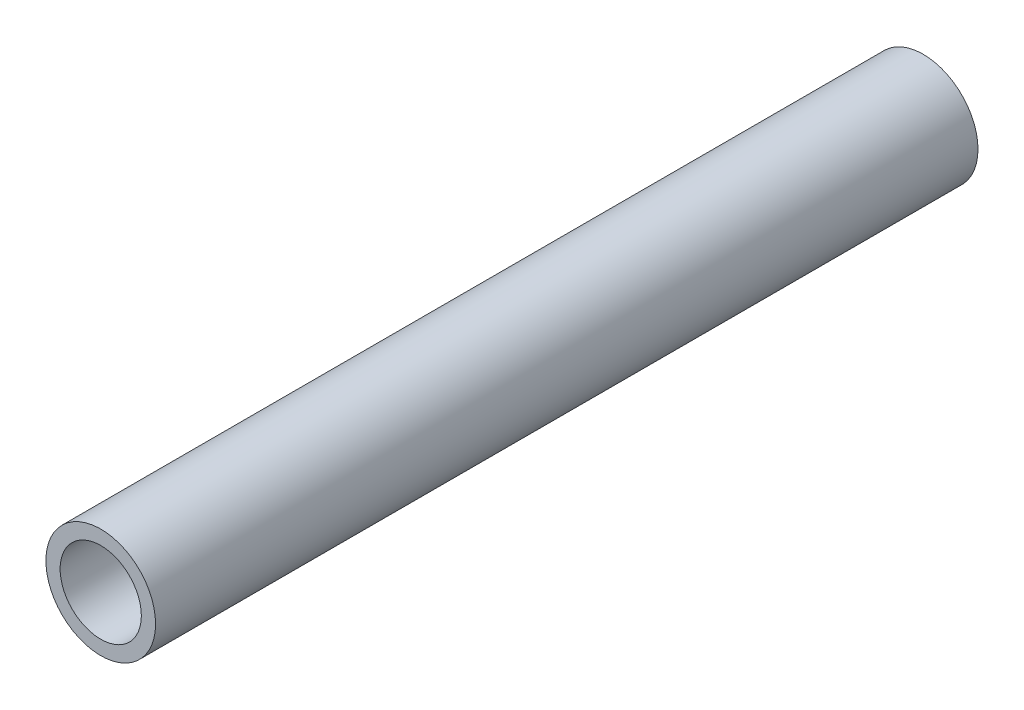
ISO-10303-21;
HEADER;
FILE_DESCRIPTION(('STEP AP214'),'2;1');
FILE_NAME('part.step','',(''),(''),'','','');
FILE_SCHEMA(('AUTOMOTIVE_DESIGN { 1 0 10303 214 1 1 1 1 }'));
ENDSEC;
DATA;
#1=APPLICATION_CONTEXT('core data for automotive mechanical design processes');
#2=APPLICATION_PROTOCOL_DEFINITION('international standard','automotive_design',2000,#1);
#3=PRODUCT_CONTEXT('',#1,'mechanical');
#4=PRODUCT('Part','Part','',(#3));
#5=PRODUCT_RELATED_PRODUCT_CATEGORY('part','',(#4));
#6=PRODUCT_DEFINITION_FORMATION('','',#4);
#7=PRODUCT_DEFINITION_CONTEXT('part definition',#1,'design');
#8=PRODUCT_DEFINITION('design','',#6,#7);
#9=PRODUCT_DEFINITION_SHAPE('','',#8);
#10=(LENGTH_UNIT() NAMED_UNIT(*) SI_UNIT(.MILLI.,.METRE.));
#11=(NAMED_UNIT(*) PLANE_ANGLE_UNIT() SI_UNIT($,.RADIAN.));
#12=(NAMED_UNIT(*) SI_UNIT($,.STERADIAN.) SOLID_ANGLE_UNIT());
#13=UNCERTAINTY_MEASURE_WITH_UNIT(LENGTH_MEASURE(1.E-05),#10,'distance_accuracy_value','');
#14=(GEOMETRIC_REPRESENTATION_CONTEXT(3) GLOBAL_UNCERTAINTY_ASSIGNED_CONTEXT((#13)) GLOBAL_UNIT_ASSIGNED_CONTEXT((#10,
#11,#12)) REPRESENTATION_CONTEXT('',''));
#15=CARTESIAN_POINT('',(0.,0.,0.));
#16=DIRECTION('',(0.,0.,1.));
#17=DIRECTION('',(1.,0.,0.));
#18=AXIS2_PLACEMENT_3D('',#15,#16,#17);
#19=CARTESIAN_POINT('',(0.,0.,80.));
#20=DIRECTION('',(0.,0.,1.));
#21=DIRECTION('',(1.,0.,0.));
#22=AXIS2_PLACEMENT_3D('',#19,#20,#21);
#23=PLANE('',#22);
#24=CARTESIAN_POINT('',(0.,0.,80.));
#25=DIRECTION('',(0.,0.,1.));
#26=DIRECTION('',(1.,0.,0.));
#27=AXIS2_PLACEMENT_3D('',#24,#25,#26);
#28=CIRCLE('',#27,10.668);
#29=CARTESIAN_POINT('',(10.668,0.,80.));
#30=VERTEX_POINT('',#29);
#31=EDGE_CURVE('E11',#30,#30,#28,.T.);
#32=ORIENTED_EDGE('',*,*,#31,.T.);
#33=EDGE_LOOP('',(#32));
#34=FACE_BOUND('',#33,.T.);
#35=CARTESIAN_POINT('',(0.,0.,80.));
#36=DIRECTION('',(0.,0.,1.));
#37=DIRECTION('',(1.,0.,0.));
#38=AXIS2_PLACEMENT_3D('',#35,#36,#37);
#39=CIRCLE('',#38,7.8994);
#40=CARTESIAN_POINT('',(7.8994,0.,80.));
#41=VERTEX_POINT('',#40);
#42=EDGE_CURVE('E56',#41,#41,#39,.T.);
#43=ORIENTED_EDGE('',*,*,#42,.F.);
#44=EDGE_LOOP('',(#43));
#45=FACE_BOUND('',#44,.T.);
#46=ADVANCED_FACE('F43',(#34,#45),#23,.T.);
#47=CARTESIAN_POINT('',(0.,0.,-80.));
#48=DIRECTION('',(0.,0.,1.));
#49=DIRECTION('',(1.,0.,0.));
#50=AXIS2_PLACEMENT_3D('',#47,#48,#49);
#51=PLANE('',#50);
#52=CARTESIAN_POINT('',(0.,0.,-80.));
#53=DIRECTION('',(0.,0.,1.));
#54=DIRECTION('',(1.,0.,0.));
#55=AXIS2_PLACEMENT_3D('',#52,#53,#54);
#56=CIRCLE('',#55,10.668);
#57=CARTESIAN_POINT('',(10.668,0.,-80.));
#58=VERTEX_POINT('',#57);
#59=EDGE_CURVE('E47',#58,#58,#56,.T.);
#60=ORIENTED_EDGE('',*,*,#59,.F.);
#61=EDGE_LOOP('',(#60));
#62=FACE_BOUND('',#61,.T.);
#63=CARTESIAN_POINT('',(0.,0.,-80.));
#64=DIRECTION('',(0.,0.,1.));
#65=DIRECTION('',(1.,0.,0.));
#66=AXIS2_PLACEMENT_3D('',#63,#64,#65);
#67=CIRCLE('',#66,7.8994);
#68=CARTESIAN_POINT('',(7.8994,0.,-80.));
#69=VERTEX_POINT('',#68);
#70=EDGE_CURVE('E58',#69,#69,#67,.T.);
#71=ORIENTED_EDGE('',*,*,#70,.T.);
#72=EDGE_LOOP('',(#71));
#73=FACE_BOUND('',#72,.T.);
#74=ADVANCED_FACE('F70',(#62,#73),#51,.F.);
#75=CARTESIAN_POINT('',(0.,0.,80.));
#76=DIRECTION('',(0.,0.,-1.));
#77=DIRECTION('',(-1.,0.,0.));
#78=AXIS2_PLACEMENT_3D('',#75,#76,#77);
#79=CYLINDRICAL_SURFACE('',#78,10.668);
#80=ORIENTED_EDGE('',*,*,#31,.F.);
#81=EDGE_LOOP('',(#80));
#82=FACE_BOUND('',#81,.T.);
#83=ORIENTED_EDGE('',*,*,#59,.T.);
#84=EDGE_LOOP('',(#83));
#85=FACE_BOUND('',#84,.T.);
#86=ADVANCED_FACE('F45',(#82,#85),#79,.T.);
#87=CARTESIAN_POINT('',(0.,0.,80.));
#88=DIRECTION('',(0.,0.,-1.));
#89=DIRECTION('',(-1.,0.,0.));
#90=AXIS2_PLACEMENT_3D('',#87,#88,#89);
#91=CYLINDRICAL_SURFACE('',#90,7.8994);
#92=ORIENTED_EDGE('',*,*,#42,.T.);
#93=EDGE_LOOP('',(#92));
#94=FACE_BOUND('',#93,.T.);
#95=ORIENTED_EDGE('',*,*,#70,.F.);
#96=EDGE_LOOP('',(#95));
#97=FACE_BOUND('',#96,.T.);
#98=ADVANCED_FACE('F66',(#94,#97),#91,.F.);
#99=CLOSED_SHELL('',(#46,#74,#86,#98));
#100=MANIFOLD_SOLID_BREP('B2',#99);
#101=ADVANCED_BREP_SHAPE_REPRESENTATION('',(#18,#100),#14);
#102=SHAPE_DEFINITION_REPRESENTATION(#9,#101);
ENDSEC;
END-ISO-10303-21;
